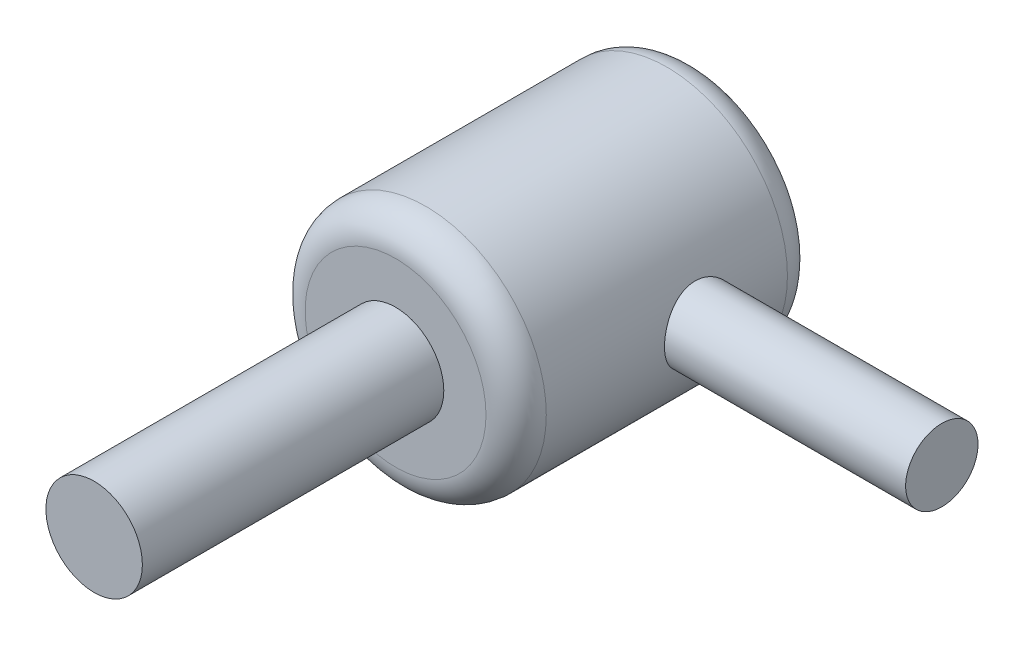
ISO-10303-21;
HEADER;
FILE_DESCRIPTION(('STEP AP214'),'2;1');
FILE_NAME('part.step','',(''),(''),'','','');
FILE_SCHEMA(('AUTOMOTIVE_DESIGN { 1 0 10303 214 1 1 1 1 }'));
ENDSEC;
DATA;
#1=APPLICATION_CONTEXT('core data for automotive mechanical design processes');
#2=APPLICATION_PROTOCOL_DEFINITION('international standard','automotive_design',2000,#1);
#3=PRODUCT_CONTEXT('',#1,'mechanical');
#4=PRODUCT('Part','Part','',(#3));
#5=PRODUCT_RELATED_PRODUCT_CATEGORY('part','',(#4));
#6=PRODUCT_DEFINITION_FORMATION('','',#4);
#7=PRODUCT_DEFINITION_CONTEXT('part definition',#1,'design');
#8=PRODUCT_DEFINITION('design','',#6,#7);
#9=PRODUCT_DEFINITION_SHAPE('','',#8);
#10=(LENGTH_UNIT() NAMED_UNIT(*) SI_UNIT(.MILLI.,.METRE.));
#11=(NAMED_UNIT(*) PLANE_ANGLE_UNIT() SI_UNIT($,.RADIAN.));
#12=(NAMED_UNIT(*) SI_UNIT($,.STERADIAN.) SOLID_ANGLE_UNIT());
#13=UNCERTAINTY_MEASURE_WITH_UNIT(LENGTH_MEASURE(1.E-05),#10,'distance_accuracy_value','');
#14=(GEOMETRIC_REPRESENTATION_CONTEXT(3) GLOBAL_UNCERTAINTY_ASSIGNED_CONTEXT((#13)) GLOBAL_UNIT_ASSIGNED_CONTEXT((#10,
#11,#12)) REPRESENTATION_CONTEXT('',''));
#15=CARTESIAN_POINT('',(0.,0.,0.));
#16=DIRECTION('',(0.,0.,1.));
#17=DIRECTION('',(1.,0.,0.));
#18=AXIS2_PLACEMENT_3D('',#15,#16,#17);
#19=CARTESIAN_POINT('',(0.,0.,50.));
#20=DIRECTION('',(0.,0.,-1.));
#21=DIRECTION('',(-1.,0.,0.));
#22=AXIS2_PLACEMENT_3D('',#19,#20,#21);
#23=CYLINDRICAL_SURFACE('',#22,20.);
#24=CARTESIAN_POINT('',(0.,0.,5.));
#25=DIRECTION('',(0.,0.,1.));
#26=DIRECTION('',(1.,0.,0.));
#27=AXIS2_PLACEMENT_3D('',#24,#25,#26);
#28=CIRCLE('',#27,20.);
#29=CARTESIAN_POINT('',(20.,0.,5.));
#30=VERTEX_POINT('',#29);
#31=EDGE_CURVE('E51',#30,#30,#28,.T.);
#32=ORIENTED_EDGE('',*,*,#31,.T.);
#33=EDGE_LOOP('',(#32));
#34=FACE_BOUND('',#33,.T.);
#35=CARTESIAN_POINT('',(0.,0.,45.));
#36=DIRECTION('',(0.,0.,1.));
#37=DIRECTION('',(1.,0.,0.));
#38=AXIS2_PLACEMENT_3D('',#35,#36,#37);
#39=CIRCLE('',#38,20.);
#40=CARTESIAN_POINT('',(20.,0.,45.));
#41=VERTEX_POINT('',#40);
#42=EDGE_CURVE('E56',#41,#41,#39,.F.);
#43=ORIENTED_EDGE('',*,*,#42,.T.);
#44=EDGE_LOOP('',(#43));
#45=FACE_BOUND('',#44,.T.);
#46=CARTESIAN_POINT('',(20.,0.,25.3894949984713));
#47=CARTESIAN_POINT('',(20.0000061943167,-0.164652988962355,25.3895054003391));
#48=CARTESIAN_POINT('',(19.9979626497481,-0.329207080536778,25.3827142690652));
#49=CARTESIAN_POINT('',(19.9898752890164,-0.657107769728233,25.3556729960018));
#50=CARTESIAN_POINT('',(19.983831290562,-0.820454311977128,25.3354222408892));
#51=CARTESIAN_POINT('',(19.959876120728,-1.3069899936852,25.2546080010181));
#52=CARTESIAN_POINT('',(19.9361415005675,-1.62688975194063,25.1739823322279));
#53=CARTESIAN_POINT('',(19.890895000691,-2.09209536324097,25.0153400732534));
#54=CARTESIAN_POINT('',(19.8742101893185,-2.24469091025794,24.9561927089856));
#55=CARTESIAN_POINT('',(19.8380770695736,-2.5442798282622,24.8257859415097));
#56=CARTESIAN_POINT('',(19.8186296921873,-2.69127506547801,24.7545306171093));
#57=CARTESIAN_POINT('',(19.7774632947866,-2.97877080797273,24.6004028279384));
#58=CARTESIAN_POINT('',(19.755743299219,-3.11926848645876,24.5175253689675));
#59=CARTESIAN_POINT('',(19.7106054893773,-3.39282129356851,24.3407843819729));
#60=CARTESIAN_POINT('',(19.6871882300263,-3.52587882977922,24.2469244385797));
#61=CARTESIAN_POINT('',(19.6386181246383,-3.78718937871499,24.0462156329875));
#62=CARTESIAN_POINT('',(19.6134358696729,-3.91522491950796,23.9390907140251));
#63=CARTESIAN_POINT('',(19.5625911320746,-4.16183570666912,23.7146438789038));
#64=CARTESIAN_POINT('',(19.5369288144934,-4.28041413330891,23.5973254186317));
#65=CARTESIAN_POINT('',(19.4857950852645,-4.5074763675697,23.353138163406));
#66=CARTESIAN_POINT('',(19.4603237808328,-4.61595484671601,23.2262643904452));
#67=CARTESIAN_POINT('',(19.4102934857251,-4.82200644357716,22.963858224828));
#68=CARTESIAN_POINT('',(19.3857341639501,-4.91958354544309,22.8283290241393));
#69=CARTESIAN_POINT('',(19.3376596115739,-5.10532440503129,22.5462075891724));
#70=CARTESIAN_POINT('',(19.3141812571269,-5.19322086800796,22.399432889125));
#71=CARTESIAN_POINT('',(19.2696038866873,-5.35625892851186,22.0986895619424));
#72=CARTESIAN_POINT('',(19.2485039419438,-5.43140551060241,21.944723776322));
#73=CARTESIAN_POINT('',(19.2093234247761,-5.56839058903528,21.6305653946976));
#74=CARTESIAN_POINT('',(19.1912435158125,-5.63022616198977,21.4703714399537));
#75=CARTESIAN_POINT('',(19.1586962425728,-5.7400034104926,21.1450074158939));
#76=CARTESIAN_POINT('',(19.1442272983092,-5.78795116417454,20.9798395585008));
#77=CARTESIAN_POINT('',(19.1197132724719,-5.86841419209101,20.6503202308058));
#78=CARTESIAN_POINT('',(19.1095570821848,-5.90131899082046,20.4860721196986));
#79=CARTESIAN_POINT('',(19.0934313281466,-5.95328671853752,20.1552614228042));
#80=CARTESIAN_POINT('',(19.0874600760637,-5.9723552296157,19.9886997980484));
#81=CARTESIAN_POINT('',(19.0798925175117,-5.99648748794346,19.6544684226));
#82=CARTESIAN_POINT('',(19.0782961366915,-6.00155147320092,19.4867986907883));
#83=CARTESIAN_POINT('',(19.0795307675469,-5.99762541310886,19.1516422004559));
#84=CARTESIAN_POINT('',(19.0823616837336,-5.9886356708731,18.9841554380668));
#85=CARTESIAN_POINT('',(19.0921753464532,-5.95727255042276,18.656716112892));
#86=CARTESIAN_POINT('',(19.0990035168874,-5.93539727678691,18.4967108971011));
#87=CARTESIAN_POINT('',(19.1164806290194,-5.8788640838762,18.179131814236));
#88=CARTESIAN_POINT('',(19.1271308684162,-5.8442018229509,18.021558791935));
#89=CARTESIAN_POINT('',(19.151932819485,-5.76240333013389,17.710019709564));
#90=CARTESIAN_POINT('',(19.166083498533,-5.71527077667357,17.5560526003924));
#91=CARTESIAN_POINT('',(19.197484522044,-5.60889138803779,17.2526286837825));
#92=CARTESIAN_POINT('',(19.2147360404922,-5.54963996345319,17.1031736097287));
#93=CARTESIAN_POINT('',(19.2521004824143,-5.41860914961383,16.807806971077));
#94=CARTESIAN_POINT('',(19.2722484280167,-5.34667354163219,16.6619690256732));
#95=CARTESIAN_POINT('',(19.3146649351651,-5.19135839540029,16.3768221139779));
#96=CARTESIAN_POINT('',(19.3369342684599,-5.1079746874916,16.2375155514789));
#97=CARTESIAN_POINT('',(19.4060193526307,-4.84149472473183,15.8307272106469));
#98=CARTESIAN_POINT('',(19.4551429743877,-4.64196639195634,15.5741450483896));
#99=CARTESIAN_POINT('',(19.5564461769062,-4.19522722023334,15.0867046400757));
#100=CARTESIAN_POINT('',(19.6086677069877,-3.94637308831081,14.8573681210997));
#101=CARTESIAN_POINT('',(19.708488227866,-3.41305957922455,14.4432912842362));
#102=CARTESIAN_POINT('',(19.7560869275952,-3.12859796268104,14.2585537733535));
#103=CARTESIAN_POINT('',(19.8417268186871,-2.52941838637753,13.9380519980465));
#104=CARTESIAN_POINT('',(19.8797018606464,-2.21451053724271,13.8026240331527));
#105=CARTESIAN_POINT('',(19.9413407594069,-1.56498212403429,13.5870975381406));
#106=CARTESIAN_POINT('',(19.9650086076917,-1.23036708657403,13.5069835753923));
#107=CARTESIAN_POINT('',(19.9947346241024,-0.563808893335273,13.4068860062638));
#108=CARTESIAN_POINT('',(20.001394061545,-0.232200515695401,13.3848483896068));
#109=CARTESIAN_POINT('',(19.998116884843,0.429998548567459,13.3957718869422));
#110=CARTESIAN_POINT('',(19.9881824861632,0.760589365142787,13.4287256589616));
#111=CARTESIAN_POINT('',(19.9532280172506,1.4036138559207,13.5470326786901));
#112=CARTESIAN_POINT('',(19.928553693985,1.71628897439722,13.631185780164));
#113=CARTESIAN_POINT('',(19.8669734115926,2.32302067213195,13.8480706985477));
#114=CARTESIAN_POINT('',(19.8300659822451,2.61707500841264,13.9808083547319));
#115=CARTESIAN_POINT('',(19.7467880879271,3.18574067476241,14.2944971097188));
#116=CARTESIAN_POINT('',(19.7002184516695,3.45974481383896,14.4764925699453));
#117=CARTESIAN_POINT('',(19.6029315302788,3.97412373053162,14.8824338169857));
#118=CARTESIAN_POINT('',(19.5522132072788,4.21449005203532,15.1063901192378));
#119=CARTESIAN_POINT('',(19.4760967532054,4.54922702321937,15.4737029803242));
#120=CARTESIAN_POINT('',(19.45026064894,4.6581855091174,15.6039742156315));
#121=CARTESIAN_POINT('',(19.3996259011196,4.86475075364221,15.8733937036738));
#122=CARTESIAN_POINT('',(19.3748268879415,4.96236157907913,16.0125387483277));
#123=CARTESIAN_POINT('',(19.3269761097942,5.14557811014264,16.2988740165437));
#124=CARTESIAN_POINT('',(19.3039250321838,5.23117910415387,16.4460673662655));
#125=CARTESIAN_POINT('',(19.2602780503059,5.38966081627676,16.747427183171));
#126=CARTESIAN_POINT('',(19.2396811357633,5.46254677440497,16.9015907447091));
#127=CARTESIAN_POINT('',(19.2016499215192,5.59476151431613,17.215218009601));
#128=CARTESIAN_POINT('',(19.1842024524799,5.65414703177813,17.3746561807103));
#129=CARTESIAN_POINT('',(19.1529201266916,5.75922373905264,17.6982620881286));
#130=CARTESIAN_POINT('',(19.1390838263199,5.80492040228749,17.862427905253));
#131=CARTESIAN_POINT('',(19.1154663883526,5.88222586498343,18.1943181408813));
#132=CARTESIAN_POINT('',(19.1056848986582,5.91383588767302,18.3620422490716));
#133=CARTESIAN_POINT('',(19.0905022191157,5.96266568756132,18.6997668215607));
#134=CARTESIAN_POINT('',(19.0851008623644,5.97988601307375,18.8697671988723));
#135=CARTESIAN_POINT('',(19.0789911294109,5.99934947567744,19.2035543106112));
#136=CARTESIAN_POINT('',(19.07809567929,6.00218967171231,19.3673030924482));
#137=CARTESIAN_POINT('',(19.0805205123867,5.99447696292599,19.6945113369434));
#138=CARTESIAN_POINT('',(19.0838422373294,5.98391947784154,19.8579706815171));
#139=CARTESIAN_POINT('',(19.0945978974278,5.94950873362787,20.1832756781867));
#140=CARTESIAN_POINT('',(19.1020301212222,5.9256610077137,20.3451219733296));
#141=CARTESIAN_POINT('',(19.120779460377,5.86487874640266,20.6661700440791));
#142=CARTESIAN_POINT('',(19.1320980314832,5.82793930695207,20.8253708052623));
#143=CARTESIAN_POINT('',(19.1581079886463,5.74185426801889,21.1379371677861));
#144=CARTESIAN_POINT('',(19.1727542138904,5.69287144195847,21.2913514400431));
#145=CARTESIAN_POINT('',(19.205081455616,5.58284269623903,21.5935210049884));
#146=CARTESIAN_POINT('',(19.2227635611296,5.52179244655613,21.7422746030763));
#147=CARTESIAN_POINT('',(19.2606604651181,5.38811476189117,22.0341071840321));
#148=CARTESIAN_POINT('',(19.2808747206318,5.31548980793094,22.177187374798));
#149=CARTESIAN_POINT('',(19.3232987518726,5.15913622382915,22.456903774099));
#150=CARTESIAN_POINT('',(19.3455092817909,5.0754033914036,22.5935375171899));
#151=CARTESIAN_POINT('',(19.3921618083766,4.89419285356764,22.8643134582311));
#152=CARTESIAN_POINT('',(19.4166553987148,4.79632829163875,22.9981879888599));
#153=CARTESIAN_POINT('',(19.4664844419128,4.58990823503882,23.2573362232181));
#154=CARTESIAN_POINT('',(19.4918202062223,4.48134875540192,23.3826066913108));
#155=CARTESIAN_POINT('',(19.5426381296935,4.25427156732539,23.6237120080508));
#156=CARTESIAN_POINT('',(19.5681202718897,4.135754992077,23.7395479274725));
#157=CARTESIAN_POINT('',(19.6185640456246,3.88944109279144,23.9611138748855));
#158=CARTESIAN_POINT('',(19.6435254820352,3.76164036728563,24.0668401657798));
#159=CARTESIAN_POINT('',(19.6929668051115,3.49372933574993,24.2703731843231));
#160=CARTESIAN_POINT('',(19.7174114999853,3.3533689404332,24.3678596236139));
#161=CARTESIAN_POINT('',(19.7643509662278,3.06460835488667,24.5506356589319));
#162=CARTESIAN_POINT('',(19.7868457429941,2.91620818691351,24.6359252887213));
#163=CARTESIAN_POINT('',(19.8292394183505,2.61242605400207,24.7936141512714));
#164=CARTESIAN_POINT('',(19.8491393311791,2.45704684903702,24.8660184245128));
#165=CARTESIAN_POINT('',(19.8857816569282,2.14034959560566,24.9973725905578));
#166=CARTESIAN_POINT('',(19.902524302807,1.9790319863539,25.0563234760844));
#167=CARTESIAN_POINT('',(19.9307619405582,1.66920359777035,25.1546707272363));
#168=CARTESIAN_POINT('',(19.9426273368462,1.52117718337224,25.1954869667533));
#169=CARTESIAN_POINT('',(19.963183177199,1.22223078035859,25.265699431894));
#170=CARTESIAN_POINT('',(19.9718728622351,1.07131010904471,25.2950929274665));
#171=CARTESIAN_POINT('',(19.9928210975698,0.61563273540516,25.3657115888938));
#172=CARTESIAN_POINT('',(19.9999884263094,0.307643739499024,25.3894755632364));
#173=CARTESIAN_POINT('',(20.,0.,25.3894949984713));
#174=B_SPLINE_CURVE_WITH_KNOTS('',3,(#46,#47,#48,#49,#50,#51,#52,#53,#54,#55,#56,#57,#58,#59,
#60,#61,#62,#63,#64,#65,#66,#67,#68,#69,#70,#71,#72,#73,#74,#75,#76,#77,#78,#79,#80,#81,#82,#83,
#84,#85,#86,#87,#88,#89,#90,#91,#92,#93,#94,#95,#96,#97,#98,#99,#100,#101,#102,#103,#104,#105,
#106,#107,#108,#109,#110,#111,#112,#113,#114,#115,#116,#117,#118,#119,#120,#121,#122,#123,#124,
#125,#126,#127,#128,#129,#130,#131,#132,#133,#134,#135,#136,#137,#138,#139,#140,#141,#142,#143,
#144,#145,#146,#147,#148,#149,#150,#151,#152,#153,#154,#155,#156,#157,#158,#159,#160,#161,#162,
#163,#164,#165,#166,#167,#168,#169,#170,#171,#172,#173),.UNSPECIFIED.,.T.,.F.,(4,2,2,2,2,2,2,2,
2,2,2,2,2,2,2,2,2,2,2,2,2,2,2,2,2,2,2,2,2,2,2,2,2,2,2,2,2,2,2,2,2,2,2,2,2,2,2,2,2,2,2,2,2,2,2,2,
2,2,2,2,2,2,2,4),(0.,0.493608825161867,0.987240144449519,1.97386718938308,2.46696137265367,
2.95988977543069,3.4530306495149,3.9460110114252,4.45191823112247,4.9576545988542,
5.46365628598868,5.9694724343614,6.48689212555164,7.00410906316543,7.52143947726538,
8.0385431335795,8.54137016908293,9.04399423186043,9.54660975245499,10.0492144326819,
10.5335590622771,11.0180682961996,11.5024347707745,11.9869850153982,12.477983219729,
12.9691607335528,13.9507580820103,14.9733478375947,15.9960019369109,17.0255055509356,
18.0547218168204,19.0470160532099,20.0391778176811,21.0089335429611,21.9788058594172,
22.9711159037844,23.9636749556757,24.4785258363334,24.9931916305645,25.5080587737426,
26.022713230249,26.535163130452,27.0474078556944,27.5596080909458,28.0717888081198,
28.5625187303198,29.0534164634898,29.5441099704357,30.0349874819556,30.5195637575114,
31.0043142250351,31.4889609263675,31.9737915027988,32.476111121644,32.9786186196612,
33.4810690058717,33.9837044142291,34.5009771901131,35.0182485340952,35.5353170854798,
36.0523474701261,36.5138710814957,36.9755049298971,37.8977819306337),.UNSPECIFIED.);
#175=CARTESIAN_POINT('',(20.,0.,25.3894949984713));
#176=VERTEX_POINT('',#175);
#177=EDGE_CURVE('E10',#176,#176,#174,.T.);
#178=ORIENTED_EDGE('',*,*,#177,.F.);
#179=EDGE_LOOP('',(#178));
#180=FACE_BOUND('',#179,.T.);
#181=ADVANCED_FACE('F31',(#34,#45,#180),#23,.T.);
#182=CARTESIAN_POINT('',(0.,0.,50.));
#183=DIRECTION('',(0.,0.,1.));
#184=DIRECTION('',(1.,0.,0.));
#185=AXIS2_PLACEMENT_3D('',#182,#183,#184);
#186=PLANE('',#185);
#187=CARTESIAN_POINT('',(0.,0.,50.));
#188=DIRECTION('',(0.,0.,1.));
#189=DIRECTION('',(1.,0.,0.));
#190=AXIS2_PLACEMENT_3D('',#187,#188,#189);
#191=CIRCLE('',#190,8.);
#192=CARTESIAN_POINT('',(8.,0.,50.));
#193=VERTEX_POINT('',#192);
#194=EDGE_CURVE('E60',#193,#193,#191,.T.);
#195=ORIENTED_EDGE('',*,*,#194,.F.);
#196=EDGE_LOOP('',(#195));
#197=FACE_BOUND('',#196,.T.);
#198=CARTESIAN_POINT('',(0.,0.,50.));
#199=DIRECTION('',(0.,0.,1.));
#200=DIRECTION('',(1.,0.,0.));
#201=AXIS2_PLACEMENT_3D('',#198,#199,#200);
#202=CIRCLE('',#201,15.);
#203=CARTESIAN_POINT('',(15.,0.,50.));
#204=VERTEX_POINT('',#203);
#205=EDGE_CURVE('E43',#204,#204,#202,.T.);
#206=ORIENTED_EDGE('',*,*,#205,.T.);
#207=EDGE_LOOP('',(#206));
#208=FACE_BOUND('',#207,.T.);
#209=ADVANCED_FACE('F84',(#197,#208),#186,.T.);
#210=CARTESIAN_POINT('',(0.,0.,0.));
#211=DIRECTION('',(0.,0.,1.));
#212=DIRECTION('',(1.,0.,0.));
#213=AXIS2_PLACEMENT_3D('',#210,#211,#212);
#214=PLANE('',#213);
#215=CARTESIAN_POINT('',(0.,0.,0.));
#216=DIRECTION('',(0.,0.,1.));
#217=DIRECTION('',(1.,0.,0.));
#218=AXIS2_PLACEMENT_3D('',#215,#216,#217);
#219=CIRCLE('',#218,15.);
#220=CARTESIAN_POINT('',(15.,0.,0.));
#221=VERTEX_POINT('',#220);
#222=EDGE_CURVE('E47',#221,#221,#219,.F.);
#223=ORIENTED_EDGE('',*,*,#222,.T.);
#224=EDGE_LOOP('',(#223));
#225=FACE_BOUND('',#224,.T.);
#226=ADVANCED_FACE('F89',(#225),#214,.F.);
#227=CARTESIAN_POINT('',(0.,0.,5.));
#228=DIRECTION('',(0.,0.,1.));
#229=DIRECTION('',(1.,0.,0.));
#230=AXIS2_PLACEMENT_3D('',#227,#228,#229);
#231=TOROIDAL_SURFACE('',#230,15.,5.);
#232=ORIENTED_EDGE('',*,*,#222,.F.);
#233=EDGE_LOOP('',(#232));
#234=FACE_BOUND('',#233,.T.);
#235=ORIENTED_EDGE('',*,*,#31,.F.);
#236=EDGE_LOOP('',(#235));
#237=FACE_BOUND('',#236,.T.);
#238=ADVANCED_FACE('F95',(#234,#237),#231,.T.);
#239=CARTESIAN_POINT('',(0.,0.,45.));
#240=DIRECTION('',(0.,0.,1.));
#241=DIRECTION('',(1.,0.,0.));
#242=AXIS2_PLACEMENT_3D('',#239,#240,#241);
#243=TOROIDAL_SURFACE('',#242,15.,5.);
#244=ORIENTED_EDGE('',*,*,#42,.F.);
#245=EDGE_LOOP('',(#244));
#246=FACE_BOUND('',#245,.T.);
#247=ORIENTED_EDGE('',*,*,#205,.F.);
#248=EDGE_LOOP('',(#247));
#249=FACE_BOUND('',#248,.T.);
#250=ADVANCED_FACE('F33',(#246,#249),#243,.T.);
#251=CARTESIAN_POINT('',(0.,0.,100.));
#252=DIRECTION('',(0.,0.,-1.));
#253=DIRECTION('',(-1.,0.,0.));
#254=AXIS2_PLACEMENT_3D('',#251,#252,#253);
#255=CYLINDRICAL_SURFACE('',#254,8.);
#256=CARTESIAN_POINT('',(0.,0.,100.));
#257=DIRECTION('',(0.,0.,1.));
#258=DIRECTION('',(1.,0.,0.));
#259=AXIS2_PLACEMENT_3D('',#256,#257,#258);
#260=CIRCLE('',#259,8.);
#261=CARTESIAN_POINT('',(8.,0.,100.));
#262=VERTEX_POINT('',#261);
#263=EDGE_CURVE('E59',#262,#262,#260,.T.);
#264=ORIENTED_EDGE('',*,*,#263,.F.);
#265=EDGE_LOOP('',(#264));
#266=FACE_BOUND('',#265,.T.);
#267=ORIENTED_EDGE('',*,*,#194,.T.);
#268=EDGE_LOOP('',(#267));
#269=FACE_BOUND('',#268,.T.);
#270=ADVANCED_FACE('F79',(#266,#269),#255,.T.);
#271=CARTESIAN_POINT('',(0.,0.,100.));
#272=DIRECTION('',(0.,0.,1.));
#273=DIRECTION('',(1.,0.,0.));
#274=AXIS2_PLACEMENT_3D('',#271,#272,#273);
#275=PLANE('',#274);
#276=ORIENTED_EDGE('',*,*,#263,.T.);
#277=EDGE_LOOP('',(#276));
#278=FACE_BOUND('',#277,.T.);
#279=ADVANCED_FACE('F73',(#278),#275,.T.);
#280=CARTESIAN_POINT('',(60.,0.,19.3894949984713));
#281=DIRECTION('',(-1.,0.,0.));
#282=DIRECTION('',(0.,0.,1.));
#283=AXIS2_PLACEMENT_3D('',#280,#281,#282);
#284=CYLINDRICAL_SURFACE('',#283,6.);
#285=CARTESIAN_POINT('',(60.,0.,19.3894949984713));
#286=DIRECTION('',(1.,0.,0.));
#287=DIRECTION('',(0.,0.,-1.));
#288=AXIS2_PLACEMENT_3D('',#285,#286,#287);
#289=CIRCLE('',#288,6.);
#290=CARTESIAN_POINT('',(60.,0.,13.3894949984713));
#291=VERTEX_POINT('',#290);
#292=EDGE_CURVE('E63',#291,#291,#289,.T.);
#293=ORIENTED_EDGE('',*,*,#292,.F.);
#294=EDGE_LOOP('',(#293));
#295=FACE_BOUND('',#294,.T.);
#296=ORIENTED_EDGE('',*,*,#177,.T.);
#297=EDGE_LOOP('',(#296));
#298=FACE_BOUND('',#297,.T.);
#299=ADVANCED_FACE('F71',(#295,#298),#284,.T.);
#300=CARTESIAN_POINT('',(60.,0.,19.3894949984713));
#301=DIRECTION('',(1.,0.,0.));
#302=DIRECTION('',(0.,0.,-1.));
#303=AXIS2_PLACEMENT_3D('',#300,#301,#302);
#304=PLANE('',#303);
#305=ORIENTED_EDGE('',*,*,#292,.T.);
#306=EDGE_LOOP('',(#305));
#307=FACE_BOUND('',#306,.T.);
#308=ADVANCED_FACE('F69',(#307),#304,.T.);
#309=CLOSED_SHELL('',(#181,#209,#226,#238,#250,#270,#279,#299,#308));
#310=MANIFOLD_SOLID_BREP('B2',#309);
#311=ADVANCED_BREP_SHAPE_REPRESENTATION('',(#18,#310),#14);
#312=SHAPE_DEFINITION_REPRESENTATION(#9,#311);
ENDSEC;
END-ISO-10303-21;
